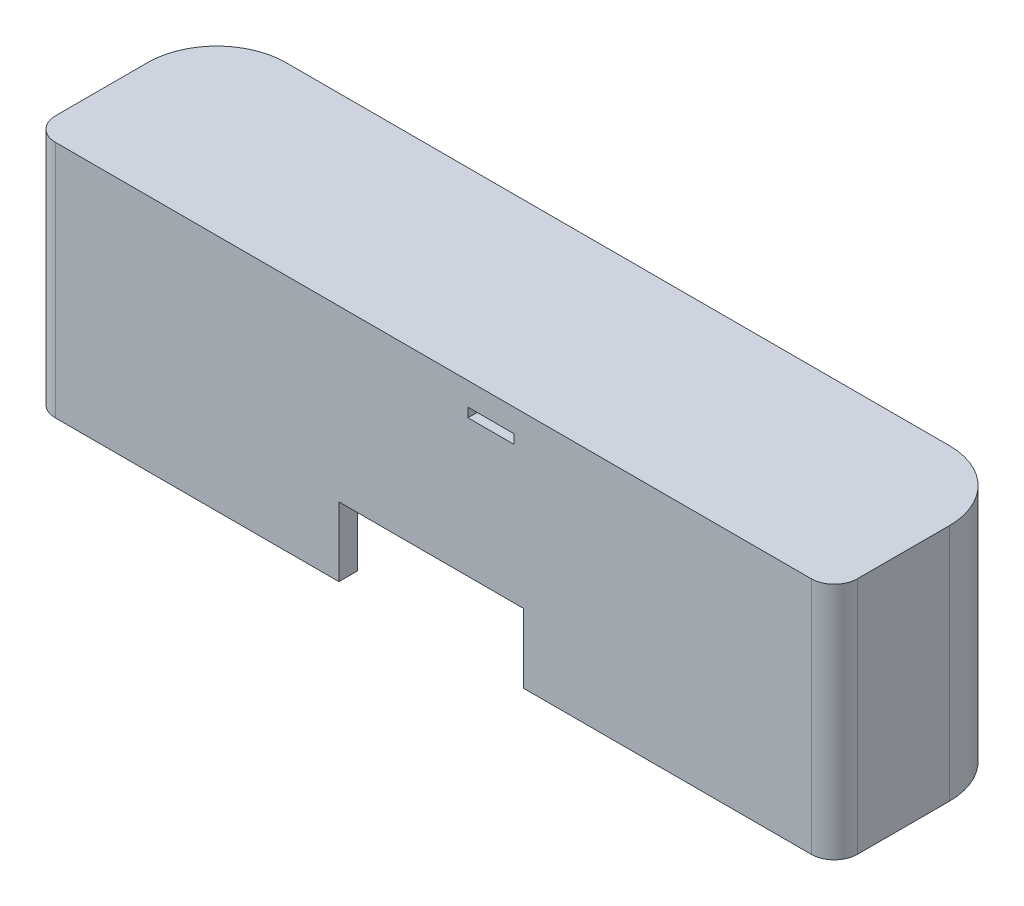
ISO-10303-21;
HEADER;
FILE_DESCRIPTION(('STEP AP214'),'2;1');
FILE_NAME('part.step','',(''),(''),'','','');
FILE_SCHEMA(('AUTOMOTIVE_DESIGN { 1 0 10303 214 1 1 1 1 }'));
ENDSEC;
DATA;
#1=APPLICATION_CONTEXT('core data for automotive mechanical design processes');
#2=APPLICATION_PROTOCOL_DEFINITION('international standard','automotive_design',2000,#1);
#3=PRODUCT_CONTEXT('',#1,'mechanical');
#4=PRODUCT('Part','Part','',(#3));
#5=PRODUCT_RELATED_PRODUCT_CATEGORY('part','',(#4));
#6=PRODUCT_DEFINITION_FORMATION('','',#4);
#7=PRODUCT_DEFINITION_CONTEXT('part definition',#1,'design');
#8=PRODUCT_DEFINITION('design','',#6,#7);
#9=PRODUCT_DEFINITION_SHAPE('','',#8);
#10=(LENGTH_UNIT() NAMED_UNIT(*) SI_UNIT(.MILLI.,.METRE.));
#11=(NAMED_UNIT(*) PLANE_ANGLE_UNIT() SI_UNIT($,.RADIAN.));
#12=(NAMED_UNIT(*) SI_UNIT($,.STERADIAN.) SOLID_ANGLE_UNIT());
#13=UNCERTAINTY_MEASURE_WITH_UNIT(LENGTH_MEASURE(1.E-05),#10,'distance_accuracy_value','');
#14=(GEOMETRIC_REPRESENTATION_CONTEXT(3) GLOBAL_UNCERTAINTY_ASSIGNED_CONTEXT((#13)) GLOBAL_UNIT_ASSIGNED_CONTEXT((#10,
#11,#12)) REPRESENTATION_CONTEXT('',''));
#15=CARTESIAN_POINT('',(0.,0.,0.));
#16=DIRECTION('',(0.,0.,1.));
#17=DIRECTION('',(1.,0.,0.));
#18=AXIS2_PLACEMENT_3D('',#15,#16,#17);
#19=CARTESIAN_POINT('',(82.,0.,15.));
#20=DIRECTION('',(0.,-1.,0.));
#21=DIRECTION('',(0.,0.,-1.));
#22=AXIS2_PLACEMENT_3D('',#19,#20,#21);
#23=PLANE('',#22);
#24=DIRECTION('',(0.,0.,1.));
#25=VECTOR('',#24,1.);
#26=CARTESIAN_POINT('',(-20.5,0.,-26.7200187265877));
#27=LINE('',#26,#25);
#28=CARTESIAN_POINT('',(-20.5,0.,16.));
#29=VERTEX_POINT('',#28);
#30=CARTESIAN_POINT('',(-20.5,0.,20.));
#31=VERTEX_POINT('',#30);
#32=EDGE_CURVE('E342',#29,#31,#27,.T.);
#33=ORIENTED_EDGE('',*,*,#32,.T.);
#34=DIRECTION('',(1.,0.,0.));
#35=VECTOR('',#34,1.);
#36=CARTESIAN_POINT('',(-82.,0.,20.));
#37=LINE('',#36,#35);
#38=CARTESIAN_POINT('',(-82.,0.,20.));
#39=VERTEX_POINT('',#38);
#40=EDGE_CURVE('E464',#39,#31,#37,.T.);
#41=ORIENTED_EDGE('',*,*,#40,.F.);
#42=CARTESIAN_POINT('',(-82.,0.,15.));
#43=DIRECTION('',(0.,1.,0.));
#44=DIRECTION('',(0.,0.,-1.));
#45=AXIS2_PLACEMENT_3D('',#42,#43,#44);
#46=CIRCLE('',#45,5.);
#47=CARTESIAN_POINT('',(-87.,0.,15.));
#48=VERTEX_POINT('',#47);
#49=EDGE_CURVE('E460',#48,#39,#46,.T.);
#50=ORIENTED_EDGE('',*,*,#49,.F.);
#51=DIRECTION('',(0.,0.,1.));
#52=VECTOR('',#51,1.);
#53=CARTESIAN_POINT('',(-87.,0.,15.));
#54=LINE('',#53,#52);
#55=CARTESIAN_POINT('',(-87.,0.,-4.9999999999999));
#56=VERTEX_POINT('',#55);
#57=EDGE_CURVE('E457',#56,#48,#54,.T.);
#58=ORIENTED_EDGE('',*,*,#57,.F.);
#59=CARTESIAN_POINT('',(-72.,0.,-5.));
#60=DIRECTION('',(0.,1.,0.));
#61=DIRECTION('',(0.,0.,1.));
#62=AXIS2_PLACEMENT_3D('',#59,#60,#61);
#63=CIRCLE('',#62,15.);
#64=CARTESIAN_POINT('',(-71.9999999999999,0.,-20.));
#65=VERTEX_POINT('',#64);
#66=EDGE_CURVE('E451',#65,#56,#63,.T.);
#67=ORIENTED_EDGE('',*,*,#66,.F.);
#68=DIRECTION('',(-1.,0.,0.));
#69=VECTOR('',#68,1.);
#70=CARTESIAN_POINT('',(-71.9999999999999,0.,-20.));
#71=LINE('',#70,#69);
#72=CARTESIAN_POINT('',(71.9999999999999,0.,-20.));
#73=VERTEX_POINT('',#72);
#74=EDGE_CURVE('E447',#73,#65,#71,.T.);
#75=ORIENTED_EDGE('',*,*,#74,.F.);
#76=CARTESIAN_POINT('',(72.,0.,-5.));
#77=DIRECTION('',(0.,1.,0.));
#78=DIRECTION('',(0.,0.,-1.));
#79=AXIS2_PLACEMENT_3D('',#76,#77,#78);
#80=CIRCLE('',#79,15.);
#81=CARTESIAN_POINT('',(87.,0.,-4.99999999999989));
#82=VERTEX_POINT('',#81);
#83=EDGE_CURVE('E437',#82,#73,#80,.T.);
#84=ORIENTED_EDGE('',*,*,#83,.F.);
#85=DIRECTION('',(0.,0.,-1.));
#86=VECTOR('',#85,1.);
#87=CARTESIAN_POINT('',(87.,0.,15.));
#88=LINE('',#87,#86);
#89=CARTESIAN_POINT('',(87.,0.,15.));
#90=VERTEX_POINT('',#89);
#91=EDGE_CURVE('E429',#90,#82,#88,.T.);
#92=ORIENTED_EDGE('',*,*,#91,.F.);
#93=CARTESIAN_POINT('',(82.,0.,15.));
#94=DIRECTION('',(0.,1.,0.));
#95=DIRECTION('',(0.,0.,-1.));
#96=AXIS2_PLACEMENT_3D('',#93,#94,#95);
#97=CIRCLE('',#96,5.);
#98=CARTESIAN_POINT('',(82.,0.,20.));
#99=VERTEX_POINT('',#98);
#100=EDGE_CURVE('E438',#99,#90,#97,.T.);
#101=ORIENTED_EDGE('',*,*,#100,.F.);
#102=CARTESIAN_POINT('',(19.5,0.,20.));
#103=VERTEX_POINT('',#102);
#104=EDGE_CURVE('E463',#103,#99,#37,.T.);
#105=ORIENTED_EDGE('',*,*,#104,.F.);
#106=DIRECTION('',(0.,0.,1.));
#107=VECTOR('',#106,1.);
#108=CARTESIAN_POINT('',(19.5,0.,-26.7200187265877));
#109=LINE('',#108,#107);
#110=CARTESIAN_POINT('',(19.5,0.,16.));
#111=VERTEX_POINT('',#110);
#112=EDGE_CURVE('E337',#111,#103,#109,.T.);
#113=ORIENTED_EDGE('',*,*,#112,.F.);
#114=DIRECTION('',(1.,0.,0.));
#115=VECTOR('',#114,1.);
#116=CARTESIAN_POINT('',(-83.,0.,16.));
#117=LINE('',#116,#115);
#118=CARTESIAN_POINT('',(83.,0.,16.));
#119=VERTEX_POINT('',#118);
#120=EDGE_CURVE('E541',#111,#119,#117,.T.);
#121=ORIENTED_EDGE('',*,*,#120,.T.);
#122=DIRECTION('',(0.,0.,-1.));
#123=VECTOR('',#122,1.);
#124=CARTESIAN_POINT('',(83.,0.,16.));
#125=LINE('',#124,#123);
#126=CARTESIAN_POINT('',(83.,0.,-2.5));
#127=VERTEX_POINT('',#126);
#128=EDGE_CURVE('E533',#119,#127,#125,.T.);
#129=ORIENTED_EDGE('',*,*,#128,.T.);
#130=CARTESIAN_POINT('',(68.08,0.,-2.5));
#131=DIRECTION('',(0.,1.,0.));
#132=DIRECTION('',(1.,0.,0.));
#133=AXIS2_PLACEMENT_3D('',#130,#131,#132);
#134=ELLIPSE('',#133,14.92,13.5);
#135=CARTESIAN_POINT('',(68.08,0.,-16.));
#136=VERTEX_POINT('',#135);
#137=EDGE_CURVE('E529',#127,#136,#134,.T.);
#138=ORIENTED_EDGE('',*,*,#137,.T.);
#139=DIRECTION('',(-1.,0.,0.));
#140=VECTOR('',#139,1.);
#141=CARTESIAN_POINT('',(-68.08,0.,-16.));
#142=LINE('',#141,#140);
#143=CARTESIAN_POINT('',(-68.08,0.,-16.));
#144=VERTEX_POINT('',#143);
#145=EDGE_CURVE('E525',#136,#144,#142,.T.);
#146=ORIENTED_EDGE('',*,*,#145,.T.);
#147=CARTESIAN_POINT('',(-68.08,0.,-2.49999999999999));
#148=DIRECTION('',(0.,1.,0.));
#149=DIRECTION('',(-1.,0.,0.));
#150=AXIS2_PLACEMENT_3D('',#147,#148,#149);
#151=ELLIPSE('',#150,14.92,13.5);
#152=CARTESIAN_POINT('',(-83.,0.,-2.49999999999999));
#153=VERTEX_POINT('',#152);
#154=EDGE_CURVE('E358',#144,#153,#151,.T.);
#155=ORIENTED_EDGE('',*,*,#154,.T.);
#156=DIRECTION('',(0.,0.,1.));
#157=VECTOR('',#156,1.);
#158=CARTESIAN_POINT('',(-83.,0.,16.));
#159=LINE('',#158,#157);
#160=CARTESIAN_POINT('',(-83.,0.,16.));
#161=VERTEX_POINT('',#160);
#162=EDGE_CURVE('E352',#153,#161,#159,.T.);
#163=ORIENTED_EDGE('',*,*,#162,.T.);
#164=EDGE_CURVE('E537',#161,#29,#117,.T.);
#165=ORIENTED_EDGE('',*,*,#164,.T.);
#166=EDGE_LOOP('',(#33,#41,#50,#58,#67,#75,#84,#92,#101,#105,#113,#121,#129,#138,#146,#155,#163,#165));
#167=FACE_BOUND('',#166,.T.);
#168=ADVANCED_FACE('F39',(#167),#23,.T.);
#169=CARTESIAN_POINT('',(82.,46.8,15.));
#170=DIRECTION('',(0.,-1.,0.));
#171=DIRECTION('',(0.,0.,-1.));
#172=AXIS2_PLACEMENT_3D('',#169,#170,#171);
#173=CYLINDRICAL_SURFACE('',#172,5.);
#174=ORIENTED_EDGE('',*,*,#100,.T.);
#175=DIRECTION('',(0.,-1.,0.));
#176=VECTOR('',#175,1.);
#177=CARTESIAN_POINT('',(87.,46.8,15.));
#178=LINE('',#177,#176);
#179=CARTESIAN_POINT('',(87.,51.8,15.));
#180=VERTEX_POINT('',#179);
#181=EDGE_CURVE('E48',#180,#90,#178,.T.);
#182=ORIENTED_EDGE('',*,*,#181,.F.);
#183=CARTESIAN_POINT('',(82.,51.8,15.));
#184=DIRECTION('',(0.,1.,0.));
#185=DIRECTION('',(0.,0.,1.));
#186=AXIS2_PLACEMENT_3D('',#183,#184,#185);
#187=CIRCLE('',#186,5.);
#188=CARTESIAN_POINT('',(81.9999999999999,51.8,20.));
#189=VERTEX_POINT('',#188);
#190=EDGE_CURVE('E308',#189,#180,#187,.T.);
#191=ORIENTED_EDGE('',*,*,#190,.F.);
#192=DIRECTION('',(0.,-1.,0.));
#193=VECTOR('',#192,1.);
#194=CARTESIAN_POINT('',(82.,46.8,20.));
#195=LINE('',#194,#193);
#196=EDGE_CURVE('E468',#189,#99,#195,.T.);
#197=ORIENTED_EDGE('',*,*,#196,.T.);
#198=EDGE_LOOP('',(#174,#182,#191,#197));
#199=FACE_BOUND('',#198,.T.);
#200=ADVANCED_FACE('F41',(#199),#173,.T.);
#201=CARTESIAN_POINT('',(87.,46.8,15.));
#202=DIRECTION('',(-1.,0.,0.));
#203=DIRECTION('',(0.,0.,1.));
#204=AXIS2_PLACEMENT_3D('',#201,#202,#203);
#205=PLANE('',#204);
#206=ORIENTED_EDGE('',*,*,#91,.T.);
#207=DIRECTION('',(0.,-1.,0.));
#208=VECTOR('',#207,1.);
#209=CARTESIAN_POINT('',(87.,46.8,-4.99999999999989));
#210=LINE('',#209,#208);
#211=CARTESIAN_POINT('',(87.,51.8,-5.));
#212=VERTEX_POINT('',#211);
#213=EDGE_CURVE('E432',#212,#82,#210,.T.);
#214=ORIENTED_EDGE('',*,*,#213,.F.);
#215=DIRECTION('',(0.,0.,-1.));
#216=VECTOR('',#215,1.);
#217=CARTESIAN_POINT('',(87.,51.8,15.));
#218=LINE('',#217,#216);
#219=EDGE_CURVE('E312',#180,#212,#218,.T.);
#220=ORIENTED_EDGE('',*,*,#219,.F.);
#221=ORIENTED_EDGE('',*,*,#181,.T.);
#222=EDGE_LOOP('',(#206,#214,#220,#221));
#223=FACE_BOUND('',#222,.T.);
#224=ADVANCED_FACE('F420',(#223),#205,.F.);
#225=CARTESIAN_POINT('',(72.,46.8,-5.));
#226=DIRECTION('',(0.,-1.,0.));
#227=DIRECTION('',(0.,0.,-1.));
#228=AXIS2_PLACEMENT_3D('',#225,#226,#227);
#229=CYLINDRICAL_SURFACE('',#228,15.);
#230=ORIENTED_EDGE('',*,*,#83,.T.);
#231=DIRECTION('',(0.,-1.,0.));
#232=VECTOR('',#231,1.);
#233=CARTESIAN_POINT('',(71.9999999999999,46.8,-20.));
#234=LINE('',#233,#232);
#235=CARTESIAN_POINT('',(72.,51.8,-20.));
#236=VERTEX_POINT('',#235);
#237=EDGE_CURVE('E443',#236,#73,#234,.T.);
#238=ORIENTED_EDGE('',*,*,#237,.F.);
#239=CARTESIAN_POINT('',(72.,51.8,-5.));
#240=DIRECTION('',(0.,1.,0.));
#241=DIRECTION('',(0.,0.,-1.));
#242=AXIS2_PLACEMENT_3D('',#239,#240,#241);
#243=CIRCLE('',#242,15.);
#244=EDGE_CURVE('E284',#212,#236,#243,.T.);
#245=ORIENTED_EDGE('',*,*,#244,.F.);
#246=ORIENTED_EDGE('',*,*,#213,.T.);
#247=EDGE_LOOP('',(#230,#238,#245,#246));
#248=FACE_BOUND('',#247,.T.);
#249=ADVANCED_FACE('F417',(#248),#229,.T.);
#250=CARTESIAN_POINT('',(-71.9999999999999,46.8,-20.));
#251=DIRECTION('',(0.,0.,1.));
#252=DIRECTION('',(1.,0.,0.));
#253=AXIS2_PLACEMENT_3D('',#250,#251,#252);
#254=PLANE('',#253);
#255=ORIENTED_EDGE('',*,*,#74,.T.);
#256=DIRECTION('',(0.,-1.,0.));
#257=VECTOR('',#256,1.);
#258=CARTESIAN_POINT('',(-71.9999999999999,46.8,-20.));
#259=LINE('',#258,#257);
#260=CARTESIAN_POINT('',(-71.9999999999999,51.8,-20.));
#261=VERTEX_POINT('',#260);
#262=EDGE_CURVE('E484',#261,#65,#259,.T.);
#263=ORIENTED_EDGE('',*,*,#262,.F.);
#264=DIRECTION('',(-1.,0.,0.));
#265=VECTOR('',#264,1.);
#266=CARTESIAN_POINT('',(-71.9999999999999,51.8,-20.));
#267=LINE('',#266,#265);
#268=EDGE_CURVE('E288',#236,#261,#267,.T.);
#269=ORIENTED_EDGE('',*,*,#268,.F.);
#270=ORIENTED_EDGE('',*,*,#237,.T.);
#271=EDGE_LOOP('',(#255,#263,#269,#270));
#272=FACE_BOUND('',#271,.T.);
#273=ADVANCED_FACE('F413',(#272),#254,.F.);
#274=CARTESIAN_POINT('',(-72.,46.8,-5.));
#275=DIRECTION('',(0.,-1.,0.));
#276=DIRECTION('',(0.,0.,-1.));
#277=AXIS2_PLACEMENT_3D('',#274,#275,#276);
#278=CYLINDRICAL_SURFACE('',#277,15.);
#279=ORIENTED_EDGE('',*,*,#66,.T.);
#280=DIRECTION('',(0.,-1.,0.));
#281=VECTOR('',#280,1.);
#282=CARTESIAN_POINT('',(-87.,46.8,-4.9999999999999));
#283=LINE('',#282,#281);
#284=CARTESIAN_POINT('',(-86.9999999999999,51.8,-4.99999999999999));
#285=VERTEX_POINT('',#284);
#286=EDGE_CURVE('E480',#285,#56,#283,.T.);
#287=ORIENTED_EDGE('',*,*,#286,.F.);
#288=CARTESIAN_POINT('',(-71.9999999999999,51.8,-5.));
#289=DIRECTION('',(0.,1.,0.));
#290=DIRECTION('',(0.,0.,-1.));
#291=AXIS2_PLACEMENT_3D('',#288,#289,#290);
#292=CIRCLE('',#291,15.);
#293=EDGE_CURVE('E292',#261,#285,#292,.T.);
#294=ORIENTED_EDGE('',*,*,#293,.F.);
#295=ORIENTED_EDGE('',*,*,#262,.T.);
#296=EDGE_LOOP('',(#279,#287,#294,#295));
#297=FACE_BOUND('',#296,.T.);
#298=ADVANCED_FACE('F409',(#297),#278,.T.);
#299=CARTESIAN_POINT('',(-87.,46.8,15.));
#300=DIRECTION('',(1.,0.,0.));
#301=DIRECTION('',(0.,0.,-1.));
#302=AXIS2_PLACEMENT_3D('',#299,#300,#301);
#303=PLANE('',#302);
#304=ORIENTED_EDGE('',*,*,#57,.T.);
#305=DIRECTION('',(0.,-1.,0.));
#306=VECTOR('',#305,1.);
#307=CARTESIAN_POINT('',(-87.,46.8,15.));
#308=LINE('',#307,#306);
#309=CARTESIAN_POINT('',(-87.,51.8,15.));
#310=VERTEX_POINT('',#309);
#311=EDGE_CURVE('E476',#310,#48,#308,.T.);
#312=ORIENTED_EDGE('',*,*,#311,.F.);
#313=DIRECTION('',(0.,0.,1.));
#314=VECTOR('',#313,1.);
#315=CARTESIAN_POINT('',(-87.,51.8,15.));
#316=LINE('',#315,#314);
#317=EDGE_CURVE('E296',#285,#310,#316,.T.);
#318=ORIENTED_EDGE('',*,*,#317,.F.);
#319=ORIENTED_EDGE('',*,*,#286,.T.);
#320=EDGE_LOOP('',(#304,#312,#318,#319));
#321=FACE_BOUND('',#320,.T.);
#322=ADVANCED_FACE('F405',(#321),#303,.F.);
#323=CARTESIAN_POINT('',(-82.,46.8,15.));
#324=DIRECTION('',(0.,-1.,0.));
#325=DIRECTION('',(0.,0.,-1.));
#326=AXIS2_PLACEMENT_3D('',#323,#324,#325);
#327=CYLINDRICAL_SURFACE('',#326,5.);
#328=ORIENTED_EDGE('',*,*,#49,.T.);
#329=DIRECTION('',(0.,-1.,0.));
#330=VECTOR('',#329,1.);
#331=CARTESIAN_POINT('',(-82.,46.8,20.));
#332=LINE('',#331,#330);
#333=CARTESIAN_POINT('',(-81.9999999999999,51.8,20.));
#334=VERTEX_POINT('',#333);
#335=EDGE_CURVE('E472',#334,#39,#332,.T.);
#336=ORIENTED_EDGE('',*,*,#335,.F.);
#337=CARTESIAN_POINT('',(-81.9999999999999,51.8,15.));
#338=DIRECTION('',(0.,1.,0.));
#339=DIRECTION('',(0.,0.,1.));
#340=AXIS2_PLACEMENT_3D('',#337,#338,#339);
#341=CIRCLE('',#340,5.);
#342=EDGE_CURVE('E300',#310,#334,#341,.T.);
#343=ORIENTED_EDGE('',*,*,#342,.F.);
#344=ORIENTED_EDGE('',*,*,#311,.T.);
#345=EDGE_LOOP('',(#328,#336,#343,#344));
#346=FACE_BOUND('',#345,.T.);
#347=ADVANCED_FACE('F401',(#346),#327,.T.);
#348=CARTESIAN_POINT('',(-82.,46.8,20.));
#349=DIRECTION('',(0.,0.,-1.));
#350=DIRECTION('',(-1.,0.,0.));
#351=AXIS2_PLACEMENT_3D('',#348,#349,#350);
#352=PLANE('',#351);
#353=DIRECTION('',(-1.,0.,0.));
#354=VECTOR('',#353,1.);
#355=CARTESIAN_POINT('',(7.49999999999997,46.8,20.));
#356=LINE('',#355,#354);
#357=CARTESIAN_POINT('',(17.5,46.8,20.));
#358=VERTEX_POINT('',#357);
#359=CARTESIAN_POINT('',(7.49999999999997,46.8,20.));
#360=VERTEX_POINT('',#359);
#361=EDGE_CURVE('E253',#358,#360,#356,.T.);
#362=ORIENTED_EDGE('',*,*,#361,.F.);
#363=DIRECTION('',(0.,1.,0.));
#364=VECTOR('',#363,1.);
#365=CARTESIAN_POINT('',(17.5,46.8,20.));
#366=LINE('',#365,#364);
#367=CARTESIAN_POINT('',(17.5,44.8,20.));
#368=VERTEX_POINT('',#367);
#369=EDGE_CURVE('E55',#368,#358,#366,.T.);
#370=ORIENTED_EDGE('',*,*,#369,.F.);
#371=DIRECTION('',(1.,0.,0.));
#372=VECTOR('',#371,1.);
#373=CARTESIAN_POINT('',(7.49999999999997,44.8,20.));
#374=LINE('',#373,#372);
#375=CARTESIAN_POINT('',(7.49999999999997,44.8,20.));
#376=VERTEX_POINT('',#375);
#377=EDGE_CURVE('E240',#376,#368,#374,.T.);
#378=ORIENTED_EDGE('',*,*,#377,.F.);
#379=DIRECTION('',(0.,-1.,0.));
#380=VECTOR('',#379,1.);
#381=CARTESIAN_POINT('',(7.49999999999997,46.8,20.));
#382=LINE('',#381,#380);
#383=EDGE_CURVE('E244',#360,#376,#382,.T.);
#384=ORIENTED_EDGE('',*,*,#383,.F.);
#385=EDGE_LOOP('',(#362,#370,#378,#384));
#386=FACE_BOUND('',#385,.T.);
#387=ORIENTED_EDGE('',*,*,#40,.T.);
#388=DIRECTION('',(0.,-1.,0.));
#389=VECTOR('',#388,1.);
#390=CARTESIAN_POINT('',(-20.5,15.,20.));
#391=LINE('',#390,#389);
#392=CARTESIAN_POINT('',(-20.5,15.,20.));
#393=VERTEX_POINT('',#392);
#394=EDGE_CURVE('E317',#393,#31,#391,.T.);
#395=ORIENTED_EDGE('',*,*,#394,.F.);
#396=DIRECTION('',(-1.,0.,0.));
#397=VECTOR('',#396,1.);
#398=CARTESIAN_POINT('',(19.5,15.,20.));
#399=LINE('',#398,#397);
#400=CARTESIAN_POINT('',(19.5,15.,20.));
#401=VERTEX_POINT('',#400);
#402=EDGE_CURVE('E321',#401,#393,#399,.T.);
#403=ORIENTED_EDGE('',*,*,#402,.F.);
#404=DIRECTION('',(0.,1.,0.));
#405=VECTOR('',#404,1.);
#406=CARTESIAN_POINT('',(19.5,15.,20.));
#407=LINE('',#406,#405);
#408=EDGE_CURVE('E316',#103,#401,#407,.T.);
#409=ORIENTED_EDGE('',*,*,#408,.F.);
#410=ORIENTED_EDGE('',*,*,#104,.T.);
#411=ORIENTED_EDGE('',*,*,#196,.F.);
#412=DIRECTION('',(1.,0.,0.));
#413=VECTOR('',#412,1.);
#414=CARTESIAN_POINT('',(-81.9999999999999,51.8,20.));
#415=LINE('',#414,#413);
#416=EDGE_CURVE('E304',#334,#189,#415,.T.);
#417=ORIENTED_EDGE('',*,*,#416,.F.);
#418=ORIENTED_EDGE('',*,*,#335,.T.);
#419=EDGE_LOOP('',(#387,#395,#403,#409,#410,#411,#417,#418));
#420=FACE_BOUND('',#419,.T.);
#421=ADVANCED_FACE('F394',(#386,#420),#352,.F.);
#422=CARTESIAN_POINT('',(-83.,46.8,16.));
#423=DIRECTION('',(1.,0.,0.));
#424=DIRECTION('',(0.,0.,-1.));
#425=AXIS2_PLACEMENT_3D('',#422,#423,#424);
#426=PLANE('',#425);
#427=ORIENTED_EDGE('',*,*,#162,.F.);
#428=DIRECTION('',(0.,-1.,0.));
#429=VECTOR('',#428,1.);
#430=CARTESIAN_POINT('',(-83.,46.8,-2.49999999999999));
#431=LINE('',#430,#429);
#432=CARTESIAN_POINT('',(-83.,46.8,-2.49999999999999));
#433=VERTEX_POINT('',#432);
#434=EDGE_CURVE('E517',#433,#153,#431,.T.);
#435=ORIENTED_EDGE('',*,*,#434,.F.);
#436=DIRECTION('',(0.,0.,1.));
#437=VECTOR('',#436,1.);
#438=CARTESIAN_POINT('',(-83.,46.8,16.));
#439=LINE('',#438,#437);
#440=CARTESIAN_POINT('',(-83.,46.8,16.));
#441=VERTEX_POINT('',#440);
#442=EDGE_CURVE('E353',#433,#441,#439,.T.);
#443=ORIENTED_EDGE('',*,*,#442,.T.);
#444=DIRECTION('',(0.,-1.,0.));
#445=VECTOR('',#444,1.);
#446=CARTESIAN_POINT('',(-83.,46.8,16.));
#447=LINE('',#446,#445);
#448=EDGE_CURVE('E499',#441,#161,#447,.T.);
#449=ORIENTED_EDGE('',*,*,#448,.T.);
#450=EDGE_LOOP('',(#427,#435,#443,#449));
#451=FACE_BOUND('',#450,.T.);
#452=ADVANCED_FACE('F390',(#451),#426,.T.);
#453=CARTESIAN_POINT('',(-83.,46.8,16.));
#454=DIRECTION('',(0.,0.,-1.));
#455=DIRECTION('',(-1.,0.,0.));
#456=AXIS2_PLACEMENT_3D('',#453,#454,#455);
#457=PLANE('',#456);
#458=DIRECTION('',(0.,-1.,0.));
#459=VECTOR('',#458,1.);
#460=CARTESIAN_POINT('',(17.5,46.8,16.));
#461=LINE('',#460,#459);
#462=CARTESIAN_POINT('',(17.5,46.8,16.));
#463=VERTEX_POINT('',#462);
#464=CARTESIAN_POINT('',(17.5,44.8,16.));
#465=VERTEX_POINT('',#464);
#466=EDGE_CURVE('E278',#463,#465,#461,.T.);
#467=ORIENTED_EDGE('',*,*,#466,.F.);
#468=DIRECTION('',(1.,0.,0.));
#469=VECTOR('',#468,1.);
#470=CARTESIAN_POINT('',(-83.,46.8,16.));
#471=LINE('',#470,#469);
#472=CARTESIAN_POINT('',(83.,46.8,16.));
#473=VERTEX_POINT('',#472);
#474=EDGE_CURVE('E357',#463,#473,#471,.T.);
#475=ORIENTED_EDGE('',*,*,#474,.T.);
#476=DIRECTION('',(0.,-1.,0.));
#477=VECTOR('',#476,1.);
#478=CARTESIAN_POINT('',(83.,46.8,16.));
#479=LINE('',#478,#477);
#480=EDGE_CURVE('E502',#473,#119,#479,.T.);
#481=ORIENTED_EDGE('',*,*,#480,.T.);
#482=ORIENTED_EDGE('',*,*,#120,.F.);
#483=DIRECTION('',(0.,1.,0.));
#484=VECTOR('',#483,1.);
#485=CARTESIAN_POINT('',(19.5,15.,16.));
#486=LINE('',#485,#484);
#487=CARTESIAN_POINT('',(19.5,15.,16.));
#488=VERTEX_POINT('',#487);
#489=EDGE_CURVE('E332',#111,#488,#486,.T.);
#490=ORIENTED_EDGE('',*,*,#489,.T.);
#491=DIRECTION('',(-1.,0.,0.));
#492=VECTOR('',#491,1.);
#493=CARTESIAN_POINT('',(19.5,15.,16.));
#494=LINE('',#493,#492);
#495=CARTESIAN_POINT('',(-20.5,15.,16.));
#496=VERTEX_POINT('',#495);
#497=EDGE_CURVE('E320',#488,#496,#494,.T.);
#498=ORIENTED_EDGE('',*,*,#497,.T.);
#499=DIRECTION('',(0.,-1.,0.));
#500=VECTOR('',#499,1.);
#501=CARTESIAN_POINT('',(-20.5,15.,16.));
#502=LINE('',#501,#500);
#503=EDGE_CURVE('E338',#496,#29,#502,.T.);
#504=ORIENTED_EDGE('',*,*,#503,.T.);
#505=ORIENTED_EDGE('',*,*,#164,.F.);
#506=ORIENTED_EDGE('',*,*,#448,.F.);
#507=CARTESIAN_POINT('',(7.49999999999997,46.8,16.));
#508=VERTEX_POINT('',#507);
#509=EDGE_CURVE('E359',#441,#508,#471,.T.);
#510=ORIENTED_EDGE('',*,*,#509,.T.);
#511=DIRECTION('',(0.,1.,0.));
#512=VECTOR('',#511,1.);
#513=CARTESIAN_POINT('',(7.49999999999997,46.8,16.));
#514=LINE('',#513,#512);
#515=CARTESIAN_POINT('',(7.49999999999997,44.8,16.));
#516=VERTEX_POINT('',#515);
#517=EDGE_CURVE('E273',#516,#508,#514,.T.);
#518=ORIENTED_EDGE('',*,*,#517,.F.);
#519=DIRECTION('',(-1.,0.,0.));
#520=VECTOR('',#519,1.);
#521=CARTESIAN_POINT('',(-83.,44.8,16.));
#522=LINE('',#521,#520);
#523=EDGE_CURVE('E281',#465,#516,#522,.T.);
#524=ORIENTED_EDGE('',*,*,#523,.F.);
#525=EDGE_LOOP('',(#467,#475,#481,#482,#490,#498,#504,#505,#506,#510,#518,#524));
#526=FACE_BOUND('',#525,.T.);
#527=ADVANCED_FACE('F386',(#526),#457,.T.);
#528=CARTESIAN_POINT('',(83.,46.8,16.));
#529=DIRECTION('',(-1.,0.,0.));
#530=DIRECTION('',(0.,0.,1.));
#531=AXIS2_PLACEMENT_3D('',#528,#529,#530);
#532=PLANE('',#531);
#533=ORIENTED_EDGE('',*,*,#128,.F.);
#534=ORIENTED_EDGE('',*,*,#480,.F.);
#535=DIRECTION('',(0.,0.,-1.));
#536=VECTOR('',#535,1.);
#537=CARTESIAN_POINT('',(83.,46.8,16.));
#538=LINE('',#537,#536);
#539=CARTESIAN_POINT('',(83.,46.8,-2.5));
#540=VERTEX_POINT('',#539);
#541=EDGE_CURVE('E363',#473,#540,#538,.T.);
#542=ORIENTED_EDGE('',*,*,#541,.T.);
#543=DIRECTION('',(0.,-1.,0.));
#544=VECTOR('',#543,1.);
#545=CARTESIAN_POINT('',(83.,46.8,-2.5));
#546=LINE('',#545,#544);
#547=EDGE_CURVE('E508',#540,#127,#546,.T.);
#548=ORIENTED_EDGE('',*,*,#547,.T.);
#549=EDGE_LOOP('',(#533,#534,#542,#548));
#550=FACE_BOUND('',#549,.T.);
#551=ADVANCED_FACE('F381',(#550),#532,.T.);
#552=CARTESIAN_POINT('',(68.08,46.8,-2.5));
#553=DIRECTION('',(0.,1.,0.));
#554=DIRECTION('',(1.,0.,0.));
#555=AXIS2_PLACEMENT_3D('',#552,#553,#554);
#556=ELLIPSE('',#555,14.92,13.5);
#557=DIRECTION('',(0.,-1.,0.));
#558=VECTOR('',#557,1.);
#559=SURFACE_OF_LINEAR_EXTRUSION('',#556,#558);
#560=ORIENTED_EDGE('',*,*,#137,.F.);
#561=ORIENTED_EDGE('',*,*,#547,.F.);
#562=CARTESIAN_POINT('',(68.08,46.8,-16.));
#563=VERTEX_POINT('',#562);
#564=EDGE_CURVE('E367',#540,#563,#556,.T.);
#565=ORIENTED_EDGE('',*,*,#564,.T.);
#566=DIRECTION('',(0.,-1.,0.));
#567=VECTOR('',#566,1.);
#568=CARTESIAN_POINT('',(68.08,46.8,-16.));
#569=LINE('',#568,#567);
#570=EDGE_CURVE('E511',#563,#136,#569,.T.);
#571=ORIENTED_EDGE('',*,*,#570,.T.);
#572=EDGE_LOOP('',(#560,#561,#565,#571));
#573=FACE_BOUND('',#572,.T.);
#574=ADVANCED_FACE('F376',(#573),#559,.T.);
#575=CARTESIAN_POINT('',(-68.08,46.8,-16.));
#576=DIRECTION('',(0.,0.,1.));
#577=DIRECTION('',(1.,0.,0.));
#578=AXIS2_PLACEMENT_3D('',#575,#576,#577);
#579=PLANE('',#578);
#580=DIRECTION('',(0.,1.,0.));
#581=VECTOR('',#580,1.);
#582=CARTESIAN_POINT('',(17.5,46.8,-16.));
#583=LINE('',#582,#581);
#584=CARTESIAN_POINT('',(17.5,44.8,-16.));
#585=VERTEX_POINT('',#584);
#586=CARTESIAN_POINT('',(17.5,46.8,-16.));
#587=VERTEX_POINT('',#586);
#588=EDGE_CURVE('E220',#585,#587,#583,.T.);
#589=ORIENTED_EDGE('',*,*,#588,.F.);
#590=DIRECTION('',(1.,0.,0.));
#591=VECTOR('',#590,1.);
#592=CARTESIAN_POINT('',(-68.08,44.8,-16.));
#593=LINE('',#592,#591);
#594=CARTESIAN_POINT('',(7.49999999999997,44.8,-16.));
#595=VERTEX_POINT('',#594);
#596=EDGE_CURVE('E11',#595,#585,#593,.T.);
#597=ORIENTED_EDGE('',*,*,#596,.F.);
#598=DIRECTION('',(0.,-1.,0.));
#599=VECTOR('',#598,1.);
#600=CARTESIAN_POINT('',(7.49999999999997,46.8,-16.));
#601=LINE('',#600,#599);
#602=CARTESIAN_POINT('',(7.49999999999997,46.8,-16.));
#603=VERTEX_POINT('',#602);
#604=EDGE_CURVE('E262',#603,#595,#601,.T.);
#605=ORIENTED_EDGE('',*,*,#604,.F.);
#606=DIRECTION('',(-1.,0.,0.));
#607=VECTOR('',#606,1.);
#608=CARTESIAN_POINT('',(-68.08,46.8,-16.));
#609=LINE('',#608,#607);
#610=CARTESIAN_POINT('',(-68.08,46.8,-16.));
#611=VERTEX_POINT('',#610);
#612=EDGE_CURVE('E372',#603,#611,#609,.T.);
#613=ORIENTED_EDGE('',*,*,#612,.T.);
#614=DIRECTION('',(0.,-1.,0.));
#615=VECTOR('',#614,1.);
#616=CARTESIAN_POINT('',(-68.08,46.8,-16.));
#617=LINE('',#616,#615);
#618=EDGE_CURVE('E514',#611,#144,#617,.T.);
#619=ORIENTED_EDGE('',*,*,#618,.T.);
#620=ORIENTED_EDGE('',*,*,#145,.F.);
#621=ORIENTED_EDGE('',*,*,#570,.F.);
#622=EDGE_CURVE('E373',#563,#587,#609,.T.);
#623=ORIENTED_EDGE('',*,*,#622,.T.);
#624=EDGE_LOOP('',(#589,#597,#605,#613,#619,#620,#621,#623));
#625=FACE_BOUND('',#624,.T.);
#626=ADVANCED_FACE('F380',(#625),#579,.T.);
#627=CARTESIAN_POINT('',(-68.08,46.8,-2.49999999999999));
#628=DIRECTION('',(0.,1.,0.));
#629=DIRECTION('',(-1.,0.,0.));
#630=AXIS2_PLACEMENT_3D('',#627,#628,#629);
#631=ELLIPSE('',#630,14.92,13.5);
#632=DIRECTION('',(0.,-1.,0.));
#633=VECTOR('',#632,1.);
#634=SURFACE_OF_LINEAR_EXTRUSION('',#631,#633);
#635=ORIENTED_EDGE('',*,*,#154,.F.);
#636=ORIENTED_EDGE('',*,*,#618,.F.);
#637=EDGE_CURVE('E521',#611,#433,#631,.T.);
#638=ORIENTED_EDGE('',*,*,#637,.T.);
#639=ORIENTED_EDGE('',*,*,#434,.T.);
#640=EDGE_LOOP('',(#635,#636,#638,#639));
#641=FACE_BOUND('',#640,.T.);
#642=ADVANCED_FACE('F547',(#641),#634,.T.);
#643=CARTESIAN_POINT('',(19.5,15.,-26.7200187265877));
#644=DIRECTION('',(0.,1.,0.));
#645=DIRECTION('',(-1.,0.,0.));
#646=AXIS2_PLACEMENT_3D('',#643,#644,#645);
#647=PLANE('',#646);
#648=DIRECTION('',(0.,0.,1.));
#649=VECTOR('',#648,1.);
#650=CARTESIAN_POINT('',(19.5,15.,-26.7200187265877));
#651=LINE('',#650,#649);
#652=EDGE_CURVE('E336',#488,#401,#651,.T.);
#653=ORIENTED_EDGE('',*,*,#652,.T.);
#654=ORIENTED_EDGE('',*,*,#402,.T.);
#655=DIRECTION('',(0.,0.,1.));
#656=VECTOR('',#655,1.);
#657=CARTESIAN_POINT('',(-20.5,15.,-26.7200187265877));
#658=LINE('',#657,#656);
#659=EDGE_CURVE('E331',#496,#393,#658,.T.);
#660=ORIENTED_EDGE('',*,*,#659,.F.);
#661=ORIENTED_EDGE('',*,*,#497,.F.);
#662=EDGE_LOOP('',(#653,#654,#660,#661));
#663=FACE_BOUND('',#662,.T.);
#664=ADVANCED_FACE('F550',(#663),#647,.F.);
#665=CARTESIAN_POINT('',(-20.5,15.,-26.7200187265877));
#666=DIRECTION('',(-1.,0.,0.));
#667=DIRECTION('',(0.,-1.,0.));
#668=AXIS2_PLACEMENT_3D('',#665,#666,#667);
#669=PLANE('',#668);
#670=ORIENTED_EDGE('',*,*,#659,.T.);
#671=ORIENTED_EDGE('',*,*,#394,.T.);
#672=ORIENTED_EDGE('',*,*,#32,.F.);
#673=ORIENTED_EDGE('',*,*,#503,.F.);
#674=EDGE_LOOP('',(#670,#671,#672,#673));
#675=FACE_BOUND('',#674,.T.);
#676=ADVANCED_FACE('F554',(#675),#669,.F.);
#677=CARTESIAN_POINT('',(19.5,15.,-26.7200187265877));
#678=DIRECTION('',(1.,0.,0.));
#679=DIRECTION('',(0.,1.,0.));
#680=AXIS2_PLACEMENT_3D('',#677,#678,#679);
#681=PLANE('',#680);
#682=ORIENTED_EDGE('',*,*,#112,.T.);
#683=ORIENTED_EDGE('',*,*,#408,.T.);
#684=ORIENTED_EDGE('',*,*,#652,.F.);
#685=ORIENTED_EDGE('',*,*,#489,.F.);
#686=EDGE_LOOP('',(#682,#683,#684,#685));
#687=FACE_BOUND('',#686,.T.);
#688=ADVANCED_FACE('F558',(#687),#681,.F.);
#689=CARTESIAN_POINT('',(72.,46.8,-5.));
#690=DIRECTION('',(0.,-1.,0.));
#691=DIRECTION('',(0.,0.,-1.));
#692=AXIS2_PLACEMENT_3D('',#689,#690,#691);
#693=PLANE('',#692);
#694=ORIENTED_EDGE('',*,*,#612,.F.);
#695=DIRECTION('',(0.,0.,1.));
#696=VECTOR('',#695,1.);
#697=CARTESIAN_POINT('',(7.49999999999997,46.8,-17.));
#698=LINE('',#697,#696);
#699=CARTESIAN_POINT('',(7.49999999999997,46.8,-17.));
#700=VERTEX_POINT('',#699);
#701=EDGE_CURVE('E229',#700,#603,#698,.T.);
#702=ORIENTED_EDGE('',*,*,#701,.F.);
#703=DIRECTION('',(-1.,0.,0.));
#704=VECTOR('',#703,1.);
#705=CARTESIAN_POINT('',(7.49999999999997,46.8,-17.));
#706=LINE('',#705,#704);
#707=CARTESIAN_POINT('',(17.5,46.8,-17.));
#708=VERTEX_POINT('',#707);
#709=EDGE_CURVE('E226',#708,#700,#706,.T.);
#710=ORIENTED_EDGE('',*,*,#709,.F.);
#711=DIRECTION('',(0.,0.,1.));
#712=VECTOR('',#711,1.);
#713=CARTESIAN_POINT('',(17.5,46.8,-17.));
#714=LINE('',#713,#712);
#715=EDGE_CURVE('E212',#708,#587,#714,.T.);
#716=ORIENTED_EDGE('',*,*,#715,.T.);
#717=ORIENTED_EDGE('',*,*,#622,.F.);
#718=ORIENTED_EDGE('',*,*,#564,.F.);
#719=ORIENTED_EDGE('',*,*,#541,.F.);
#720=ORIENTED_EDGE('',*,*,#474,.F.);
#721=EDGE_CURVE('E223',#463,#358,#714,.T.);
#722=ORIENTED_EDGE('',*,*,#721,.T.);
#723=ORIENTED_EDGE('',*,*,#361,.T.);
#724=EDGE_CURVE('E63',#508,#360,#698,.T.);
#725=ORIENTED_EDGE('',*,*,#724,.F.);
#726=ORIENTED_EDGE('',*,*,#509,.F.);
#727=ORIENTED_EDGE('',*,*,#442,.F.);
#728=ORIENTED_EDGE('',*,*,#637,.F.);
#729=EDGE_LOOP('',(#694,#702,#710,#716,#717,#718,#719,#720,#722,#723,#725,#726,#727,#728));
#730=FACE_BOUND('',#729,.T.);
#731=ADVANCED_FACE('F228',(#730),#693,.T.);
#732=CARTESIAN_POINT('',(72.,51.8,-5.));
#733=DIRECTION('',(0.,-1.,0.));
#734=DIRECTION('',(0.,0.,-1.));
#735=AXIS2_PLACEMENT_3D('',#732,#733,#734);
#736=PLANE('',#735);
#737=ORIENTED_EDGE('',*,*,#244,.T.);
#738=ORIENTED_EDGE('',*,*,#268,.T.);
#739=ORIENTED_EDGE('',*,*,#293,.T.);
#740=ORIENTED_EDGE('',*,*,#317,.T.);
#741=ORIENTED_EDGE('',*,*,#342,.T.);
#742=ORIENTED_EDGE('',*,*,#416,.T.);
#743=ORIENTED_EDGE('',*,*,#190,.T.);
#744=ORIENTED_EDGE('',*,*,#219,.T.);
#745=EDGE_LOOP('',(#737,#738,#739,#740,#741,#742,#743,#744));
#746=FACE_BOUND('',#745,.T.);
#747=ADVANCED_FACE('F565',(#746),#736,.F.);
#748=CARTESIAN_POINT('',(0.,0.,-17.));
#749=DIRECTION('',(0.,0.,1.));
#750=DIRECTION('',(1.,0.,0.));
#751=AXIS2_PLACEMENT_3D('',#748,#749,#750);
#752=PLANE('',#751);
#753=DIRECTION('',(0.,1.,0.));
#754=VECTOR('',#753,1.);
#755=CARTESIAN_POINT('',(17.5,46.8,-17.));
#756=LINE('',#755,#754);
#757=CARTESIAN_POINT('',(17.5,44.8,-17.));
#758=VERTEX_POINT('',#757);
#759=EDGE_CURVE('E217',#758,#708,#756,.T.);
#760=ORIENTED_EDGE('',*,*,#759,.T.);
#761=ORIENTED_EDGE('',*,*,#709,.T.);
#762=DIRECTION('',(0.,-1.,0.));
#763=VECTOR('',#762,1.);
#764=CARTESIAN_POINT('',(7.49999999999997,46.8,-17.));
#765=LINE('',#764,#763);
#766=CARTESIAN_POINT('',(7.49999999999997,44.8,-17.));
#767=VERTEX_POINT('',#766);
#768=EDGE_CURVE('E234',#700,#767,#765,.T.);
#769=ORIENTED_EDGE('',*,*,#768,.T.);
#770=DIRECTION('',(1.,0.,0.));
#771=VECTOR('',#770,1.);
#772=CARTESIAN_POINT('',(7.49999999999997,44.8,-17.));
#773=LINE('',#772,#771);
#774=EDGE_CURVE('E238',#767,#758,#773,.T.);
#775=ORIENTED_EDGE('',*,*,#774,.T.);
#776=EDGE_LOOP('',(#760,#761,#769,#775));
#777=FACE_BOUND('',#776,.T.);
#778=ADVANCED_FACE('F236',(#777),#752,.T.);
#779=CARTESIAN_POINT('',(7.49999999999997,46.8,-17.));
#780=DIRECTION('',(-1.,0.,0.));
#781=DIRECTION('',(0.,-1.,0.));
#782=AXIS2_PLACEMENT_3D('',#779,#780,#781);
#783=PLANE('',#782);
#784=ORIENTED_EDGE('',*,*,#604,.T.);
#785=DIRECTION('',(0.,0.,1.));
#786=VECTOR('',#785,1.);
#787=CARTESIAN_POINT('',(7.49999999999997,44.8,-17.));
#788=LINE('',#787,#786);
#789=EDGE_CURVE('E264',#767,#595,#788,.T.);
#790=ORIENTED_EDGE('',*,*,#789,.F.);
#791=ORIENTED_EDGE('',*,*,#768,.F.);
#792=ORIENTED_EDGE('',*,*,#701,.T.);
#793=EDGE_LOOP('',(#784,#790,#791,#792));
#794=FACE_BOUND('',#793,.T.);
#795=ADVANCED_FACE('F574',(#794),#783,.F.);
#796=CARTESIAN_POINT('',(7.49999999999997,44.8,-17.));
#797=DIRECTION('',(0.,-1.,0.));
#798=DIRECTION('',(0.,0.,-1.));
#799=AXIS2_PLACEMENT_3D('',#796,#797,#798);
#800=PLANE('',#799);
#801=ORIENTED_EDGE('',*,*,#596,.T.);
#802=DIRECTION('',(0.,0.,1.));
#803=VECTOR('',#802,1.);
#804=CARTESIAN_POINT('',(17.5,44.8,-17.));
#805=LINE('',#804,#803);
#806=EDGE_CURVE('E259',#758,#585,#805,.T.);
#807=ORIENTED_EDGE('',*,*,#806,.F.);
#808=ORIENTED_EDGE('',*,*,#774,.F.);
#809=ORIENTED_EDGE('',*,*,#789,.T.);
#810=EDGE_LOOP('',(#801,#807,#808,#809));
#811=FACE_BOUND('',#810,.T.);
#812=ADVANCED_FACE('F572',(#811),#800,.F.);
#813=CARTESIAN_POINT('',(17.5,46.8,-17.));
#814=DIRECTION('',(1.,0.,0.));
#815=DIRECTION('',(0.,0.,-1.));
#816=AXIS2_PLACEMENT_3D('',#813,#814,#815);
#817=PLANE('',#816);
#818=ORIENTED_EDGE('',*,*,#588,.T.);
#819=ORIENTED_EDGE('',*,*,#715,.F.);
#820=ORIENTED_EDGE('',*,*,#759,.F.);
#821=ORIENTED_EDGE('',*,*,#806,.T.);
#822=EDGE_LOOP('',(#818,#819,#820,#821));
#823=FACE_BOUND('',#822,.T.);
#824=ADVANCED_FACE('F214',(#823),#817,.F.);
#825=ORIENTED_EDGE('',*,*,#523,.T.);
#826=EDGE_CURVE('E268',#516,#376,#788,.T.);
#827=ORIENTED_EDGE('',*,*,#826,.T.);
#828=ORIENTED_EDGE('',*,*,#377,.T.);
#829=EDGE_CURVE('E263',#465,#368,#805,.T.);
#830=ORIENTED_EDGE('',*,*,#829,.F.);
#831=EDGE_LOOP('',(#825,#827,#828,#830));
#832=FACE_BOUND('',#831,.T.);
#833=ADVANCED_FACE('F571',(#832),#800,.F.);
#834=ORIENTED_EDGE('',*,*,#466,.T.);
#835=ORIENTED_EDGE('',*,*,#829,.T.);
#836=ORIENTED_EDGE('',*,*,#369,.T.);
#837=ORIENTED_EDGE('',*,*,#721,.F.);
#838=EDGE_LOOP('',(#834,#835,#836,#837));
#839=FACE_BOUND('',#838,.T.);
#840=ADVANCED_FACE('F573',(#839),#817,.F.);
#841=ORIENTED_EDGE('',*,*,#517,.T.);
#842=ORIENTED_EDGE('',*,*,#724,.T.);
#843=ORIENTED_EDGE('',*,*,#383,.T.);
#844=ORIENTED_EDGE('',*,*,#826,.F.);
#845=EDGE_LOOP('',(#841,#842,#843,#844));
#846=FACE_BOUND('',#845,.T.);
#847=ADVANCED_FACE('F578',(#846),#783,.F.);
#848=CLOSED_SHELL('',(#168,#200,#224,#249,#273,#298,#322,#347,#421,#452,#527,#551,#574,#626,
#642,#664,#676,#688,#731,#747,#778,#795,#812,#824,#833,#840,#847));
#849=MANIFOLD_SOLID_BREP('B2',#848);
#850=ADVANCED_BREP_SHAPE_REPRESENTATION('',(#18,#849),#14);
#851=SHAPE_DEFINITION_REPRESENTATION(#9,#850);
ENDSEC;
END-ISO-10303-21;
